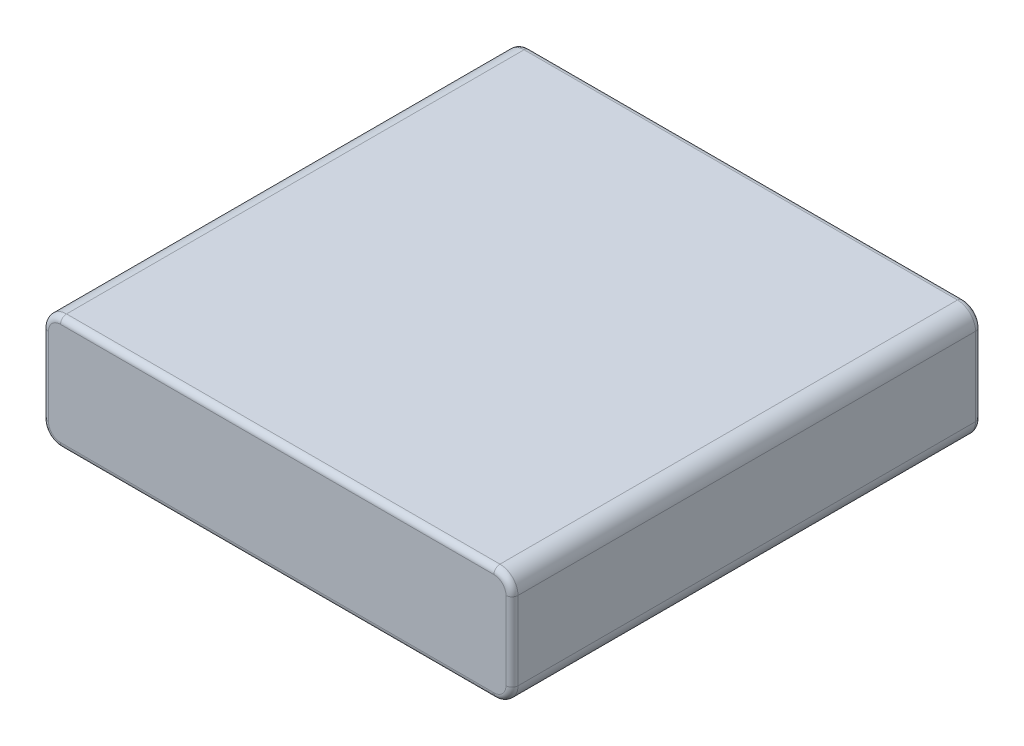
ISO-10303-21;
HEADER;
FILE_DESCRIPTION(('STEP AP214'),'2;1');
FILE_NAME('part.step','',(''),(''),'','','');
FILE_SCHEMA(('AUTOMOTIVE_DESIGN { 1 0 10303 214 1 1 1 1 }'));
ENDSEC;
DATA;
#1=APPLICATION_CONTEXT('core data for automotive mechanical design processes');
#2=APPLICATION_PROTOCOL_DEFINITION('international standard','automotive_design',2000,#1);
#3=PRODUCT_CONTEXT('',#1,'mechanical');
#4=PRODUCT('Part','Part','',(#3));
#5=PRODUCT_RELATED_PRODUCT_CATEGORY('part','',(#4));
#6=PRODUCT_DEFINITION_FORMATION('','',#4);
#7=PRODUCT_DEFINITION_CONTEXT('part definition',#1,'design');
#8=PRODUCT_DEFINITION('design','',#6,#7);
#9=PRODUCT_DEFINITION_SHAPE('','',#8);
#10=(LENGTH_UNIT() NAMED_UNIT(*) SI_UNIT(.MILLI.,.METRE.));
#11=(NAMED_UNIT(*) PLANE_ANGLE_UNIT() SI_UNIT($,.RADIAN.));
#12=(NAMED_UNIT(*) SI_UNIT($,.STERADIAN.) SOLID_ANGLE_UNIT());
#13=UNCERTAINTY_MEASURE_WITH_UNIT(LENGTH_MEASURE(1.E-05),#10,'distance_accuracy_value','');
#14=(GEOMETRIC_REPRESENTATION_CONTEXT(3) GLOBAL_UNCERTAINTY_ASSIGNED_CONTEXT((#13)) GLOBAL_UNIT_ASSIGNED_CONTEXT((#10,
#11,#12)) REPRESENTATION_CONTEXT('',''));
#15=CARTESIAN_POINT('',(0.,0.,0.));
#16=DIRECTION('',(0.,0.,1.));
#17=DIRECTION('',(1.,0.,0.));
#18=AXIS2_PLACEMENT_3D('',#15,#16,#17);
#19=CARTESIAN_POINT('',(-39.,9.5,-39.));
#20=DIRECTION('',(0.,0.,1.));
#21=DIRECTION('',(1.,0.,0.));
#22=AXIS2_PLACEMENT_3D('',#19,#20,#21);
#23=PLANE('',#22);
#24=CARTESIAN_POINT('',(33.,-2.5,-39.));
#25=DIRECTION('',(0.,0.,-1.));
#26=DIRECTION('',(-1.,0.,0.));
#27=AXIS2_PLACEMENT_3D('',#24,#25,#26);
#28=CIRCLE('',#27,1.75);
#29=CARTESIAN_POINT('',(31.25,-2.5,-39.));
#30=VERTEX_POINT('',#29);
#31=EDGE_CURVE('E222',#30,#30,#28,.T.);
#32=ORIENTED_EDGE('',*,*,#31,.F.);
#33=EDGE_LOOP('',(#32));
#34=FACE_BOUND('',#33,.T.);
#35=CARTESIAN_POINT('',(36.,-6.5,-39.));
#36=DIRECTION('',(0.,0.,1.));
#37=DIRECTION('',(1.,0.,0.));
#38=AXIS2_PLACEMENT_3D('',#35,#36,#37);
#39=CIRCLE('',#38,2.);
#40=CARTESIAN_POINT('',(36.,-8.5,-39.));
#41=VERTEX_POINT('',#40);
#42=CARTESIAN_POINT('',(38.,-6.5,-39.));
#43=VERTEX_POINT('',#42);
#44=EDGE_CURVE('E270',#41,#43,#39,.T.);
#45=ORIENTED_EDGE('',*,*,#44,.F.);
#46=DIRECTION('',(-1.,0.,0.));
#47=VECTOR('',#46,1.);
#48=CARTESIAN_POINT('',(-39.,-8.5,-39.));
#49=LINE('',#48,#47);
#50=CARTESIAN_POINT('',(-36.,-8.5,-39.));
#51=VERTEX_POINT('',#50);
#52=EDGE_CURVE('E235',#41,#51,#49,.T.);
#53=ORIENTED_EDGE('',*,*,#52,.T.);
#54=CARTESIAN_POINT('',(-36.,-6.5,-39.));
#55=DIRECTION('',(0.,0.,1.));
#56=DIRECTION('',(1.,0.,0.));
#57=AXIS2_PLACEMENT_3D('',#54,#55,#56);
#58=CIRCLE('',#57,2.);
#59=CARTESIAN_POINT('',(-38.,-6.5,-39.));
#60=VERTEX_POINT('',#59);
#61=EDGE_CURVE('E265',#60,#51,#58,.T.);
#62=ORIENTED_EDGE('',*,*,#61,.F.);
#63=DIRECTION('',(0.,-1.,0.));
#64=VECTOR('',#63,1.);
#65=CARTESIAN_POINT('',(-38.,9.5,-39.));
#66=LINE('',#65,#64);
#67=CARTESIAN_POINT('',(-38.,6.5,-39.));
#68=VERTEX_POINT('',#67);
#69=EDGE_CURVE('E242',#60,#68,#66,.F.);
#70=ORIENTED_EDGE('',*,*,#69,.T.);
#71=CARTESIAN_POINT('',(-36.,6.5,-39.));
#72=DIRECTION('',(0.,0.,1.));
#73=DIRECTION('',(1.,0.,0.));
#74=AXIS2_PLACEMENT_3D('',#71,#72,#73);
#75=CIRCLE('',#74,2.);
#76=CARTESIAN_POINT('',(-36.,8.5,-39.));
#77=VERTEX_POINT('',#76);
#78=EDGE_CURVE('E259',#77,#68,#75,.T.);
#79=ORIENTED_EDGE('',*,*,#78,.F.);
#80=DIRECTION('',(-1.,0.,0.));
#81=VECTOR('',#80,1.);
#82=CARTESIAN_POINT('',(39.,8.5,-39.));
#83=LINE('',#82,#81);
#84=CARTESIAN_POINT('',(36.,8.5,-39.));
#85=VERTEX_POINT('',#84);
#86=EDGE_CURVE('E239',#77,#85,#83,.F.);
#87=ORIENTED_EDGE('',*,*,#86,.T.);
#88=CARTESIAN_POINT('',(36.,6.5,-39.));
#89=DIRECTION('',(0.,0.,1.));
#90=DIRECTION('',(1.,0.,0.));
#91=AXIS2_PLACEMENT_3D('',#88,#89,#90);
#92=CIRCLE('',#91,2.);
#93=CARTESIAN_POINT('',(38.,6.5,-39.));
#94=VERTEX_POINT('',#93);
#95=EDGE_CURVE('E262',#94,#85,#92,.T.);
#96=ORIENTED_EDGE('',*,*,#95,.F.);
#97=DIRECTION('',(0.,-1.,0.));
#98=VECTOR('',#97,1.);
#99=CARTESIAN_POINT('',(38.,9.5,-39.));
#100=LINE('',#99,#98);
#101=EDGE_CURVE('E237',#94,#43,#100,.T.);
#102=ORIENTED_EDGE('',*,*,#101,.T.);
#103=EDGE_LOOP('',(#45,#53,#62,#70,#79,#87,#96,#102));
#104=FACE_BOUND('',#103,.T.);
#105=ADVANCED_FACE('F43',(#34,#104),#23,.F.);
#106=CARTESIAN_POINT('',(39.,9.5,-39.));
#107=DIRECTION('',(-1.,0.,0.));
#108=DIRECTION('',(0.,0.,1.));
#109=AXIS2_PLACEMENT_3D('',#106,#107,#108);
#110=PLANE('',#109);
#111=DIRECTION('',(0.,0.,-1.));
#112=VECTOR('',#111,1.);
#113=CARTESIAN_POINT('',(39.,6.5,39.));
#114=LINE('',#113,#112);
#115=CARTESIAN_POINT('',(39.,6.5,-38.));
#116=VERTEX_POINT('',#115);
#117=CARTESIAN_POINT('',(39.,6.5,38.));
#118=VERTEX_POINT('',#117);
#119=EDGE_CURVE('E299',#116,#118,#114,.F.);
#120=ORIENTED_EDGE('',*,*,#119,.T.);
#121=DIRECTION('',(0.,-1.,0.));
#122=VECTOR('',#121,1.);
#123=CARTESIAN_POINT('',(39.,9.5,38.));
#124=LINE('',#123,#122);
#125=CARTESIAN_POINT('',(39.,-6.5,38.));
#126=VERTEX_POINT('',#125);
#127=EDGE_CURVE('E11',#118,#126,#124,.T.);
#128=ORIENTED_EDGE('',*,*,#127,.T.);
#129=DIRECTION('',(0.,0.,-1.));
#130=VECTOR('',#129,1.);
#131=CARTESIAN_POINT('',(39.,-6.5,-39.));
#132=LINE('',#131,#130);
#133=CARTESIAN_POINT('',(39.,-6.5,-38.));
#134=VERTEX_POINT('',#133);
#135=EDGE_CURVE('E296',#126,#134,#132,.T.);
#136=ORIENTED_EDGE('',*,*,#135,.T.);
#137=DIRECTION('',(0.,-1.,0.));
#138=VECTOR('',#137,1.);
#139=CARTESIAN_POINT('',(39.,9.5,-38.));
#140=LINE('',#139,#138);
#141=EDGE_CURVE('E246',#134,#116,#140,.F.);
#142=ORIENTED_EDGE('',*,*,#141,.T.);
#143=EDGE_LOOP('',(#120,#128,#136,#142));
#144=FACE_BOUND('',#143,.T.);
#145=ADVANCED_FACE('F433',(#144),#110,.F.);
#146=CARTESIAN_POINT('',(-39.,9.5,-39.));
#147=DIRECTION('',(1.,0.,0.));
#148=DIRECTION('',(0.,0.,-1.));
#149=AXIS2_PLACEMENT_3D('',#146,#147,#148);
#150=PLANE('',#149);
#151=DIRECTION('',(0.,0.,1.));
#152=VECTOR('',#151,1.);
#153=CARTESIAN_POINT('',(-39.,-6.5,-39.));
#154=LINE('',#153,#152);
#155=CARTESIAN_POINT('',(-39.,-6.5,-38.));
#156=VERTEX_POINT('',#155);
#157=CARTESIAN_POINT('',(-39.,-6.5,38.));
#158=VERTEX_POINT('',#157);
#159=EDGE_CURVE('E289',#156,#158,#154,.T.);
#160=ORIENTED_EDGE('',*,*,#159,.T.);
#161=DIRECTION('',(0.,-1.,0.));
#162=VECTOR('',#161,1.);
#163=CARTESIAN_POINT('',(-39.,9.5,38.));
#164=LINE('',#163,#162);
#165=CARTESIAN_POINT('',(-39.,6.5,38.));
#166=VERTEX_POINT('',#165);
#167=EDGE_CURVE('E333',#158,#166,#164,.F.);
#168=ORIENTED_EDGE('',*,*,#167,.T.);
#169=DIRECTION('',(0.,0.,1.));
#170=VECTOR('',#169,1.);
#171=CARTESIAN_POINT('',(-39.,6.5,-38.));
#172=LINE('',#171,#170);
#173=CARTESIAN_POINT('',(-39.,6.5,-38.));
#174=VERTEX_POINT('',#173);
#175=EDGE_CURVE('E288',#166,#174,#172,.F.);
#176=ORIENTED_EDGE('',*,*,#175,.T.);
#177=DIRECTION('',(0.,-1.,0.));
#178=VECTOR('',#177,1.);
#179=CARTESIAN_POINT('',(-39.,9.5,-38.));
#180=LINE('',#179,#178);
#181=EDGE_CURVE('E229',#174,#156,#180,.T.);
#182=ORIENTED_EDGE('',*,*,#181,.T.);
#183=EDGE_LOOP('',(#160,#168,#176,#182));
#184=FACE_BOUND('',#183,.T.);
#185=ADVANCED_FACE('F377',(#184),#150,.F.);
#186=CARTESIAN_POINT('',(-39.,9.5,39.));
#187=DIRECTION('',(0.,0.,-1.));
#188=DIRECTION('',(-1.,0.,0.));
#189=AXIS2_PLACEMENT_3D('',#186,#187,#188);
#190=PLANE('',#189);
#191=DIRECTION('',(0.,-1.,0.));
#192=VECTOR('',#191,1.);
#193=CARTESIAN_POINT('',(38.,9.5,39.));
#194=LINE('',#193,#192);
#195=CARTESIAN_POINT('',(38.,-6.5,39.));
#196=VERTEX_POINT('',#195);
#197=CARTESIAN_POINT('',(38.,6.5,39.));
#198=VERTEX_POINT('',#197);
#199=EDGE_CURVE('E300',#196,#198,#194,.F.);
#200=ORIENTED_EDGE('',*,*,#199,.T.);
#201=CARTESIAN_POINT('',(36.,6.5,39.));
#202=DIRECTION('',(0.,0.,-1.));
#203=DIRECTION('',(-1.,0.,0.));
#204=AXIS2_PLACEMENT_3D('',#201,#202,#203);
#205=CIRCLE('',#204,2.);
#206=CARTESIAN_POINT('',(36.,8.5,39.));
#207=VERTEX_POINT('',#206);
#208=EDGE_CURVE('E324',#198,#207,#205,.F.);
#209=ORIENTED_EDGE('',*,*,#208,.T.);
#210=DIRECTION('',(1.,0.,0.));
#211=VECTOR('',#210,1.);
#212=CARTESIAN_POINT('',(-36.,8.5,39.));
#213=LINE('',#212,#211);
#214=CARTESIAN_POINT('',(-36.,8.5,39.));
#215=VERTEX_POINT('',#214);
#216=EDGE_CURVE('E323',#207,#215,#213,.F.);
#217=ORIENTED_EDGE('',*,*,#216,.T.);
#218=CARTESIAN_POINT('',(-36.,6.5,39.));
#219=DIRECTION('',(0.,0.,-1.));
#220=DIRECTION('',(-1.,0.,0.));
#221=AXIS2_PLACEMENT_3D('',#218,#219,#220);
#222=CIRCLE('',#221,2.);
#223=CARTESIAN_POINT('',(-38.,6.5,39.));
#224=VERTEX_POINT('',#223);
#225=EDGE_CURVE('E321',#215,#224,#222,.F.);
#226=ORIENTED_EDGE('',*,*,#225,.T.);
#227=DIRECTION('',(0.,-1.,0.));
#228=VECTOR('',#227,1.);
#229=CARTESIAN_POINT('',(-38.,9.5,39.));
#230=LINE('',#229,#228);
#231=CARTESIAN_POINT('',(-38.,-6.5,39.));
#232=VERTEX_POINT('',#231);
#233=EDGE_CURVE('E317',#224,#232,#230,.T.);
#234=ORIENTED_EDGE('',*,*,#233,.T.);
#235=CARTESIAN_POINT('',(-36.,-6.5,39.));
#236=DIRECTION('',(0.,0.,-1.));
#237=DIRECTION('',(-1.,0.,0.));
#238=AXIS2_PLACEMENT_3D('',#235,#236,#237);
#239=CIRCLE('',#238,2.);
#240=CARTESIAN_POINT('',(-36.,-8.5,39.));
#241=VERTEX_POINT('',#240);
#242=EDGE_CURVE('E320',#232,#241,#239,.F.);
#243=ORIENTED_EDGE('',*,*,#242,.T.);
#244=DIRECTION('',(1.,0.,0.));
#245=VECTOR('',#244,1.);
#246=CARTESIAN_POINT('',(-39.,-8.5,39.));
#247=LINE('',#246,#245);
#248=CARTESIAN_POINT('',(36.,-8.5,39.));
#249=VERTEX_POINT('',#248);
#250=EDGE_CURVE('E312',#241,#249,#247,.T.);
#251=ORIENTED_EDGE('',*,*,#250,.T.);
#252=CARTESIAN_POINT('',(36.,-6.5,39.));
#253=DIRECTION('',(0.,0.,-1.));
#254=DIRECTION('',(-1.,0.,0.));
#255=AXIS2_PLACEMENT_3D('',#252,#253,#254);
#256=CIRCLE('',#255,2.);
#257=EDGE_CURVE('E311',#249,#196,#256,.F.);
#258=ORIENTED_EDGE('',*,*,#257,.T.);
#259=EDGE_LOOP('',(#200,#209,#217,#226,#234,#243,#251,#258));
#260=FACE_BOUND('',#259,.T.);
#261=ADVANCED_FACE('F479',(#260),#190,.F.);
#262=CARTESIAN_POINT('',(0.,9.5,0.));
#263=DIRECTION('',(0.,1.,0.));
#264=DIRECTION('',(0.,0.,1.));
#265=AXIS2_PLACEMENT_3D('',#262,#263,#264);
#266=PLANE('',#265);
#267=DIRECTION('',(0.,0.,1.));
#268=VECTOR('',#267,1.);
#269=CARTESIAN_POINT('',(-36.,9.5,39.));
#270=LINE('',#269,#268);
#271=CARTESIAN_POINT('',(-36.,9.5,-38.));
#272=VERTEX_POINT('',#271);
#273=CARTESIAN_POINT('',(-36.,9.5,38.));
#274=VERTEX_POINT('',#273);
#275=EDGE_CURVE('E283',#272,#274,#270,.T.);
#276=ORIENTED_EDGE('',*,*,#275,.T.);
#277=DIRECTION('',(1.,0.,0.));
#278=VECTOR('',#277,1.);
#279=CARTESIAN_POINT('',(36.,9.5,38.));
#280=LINE('',#279,#278);
#281=CARTESIAN_POINT('',(36.,9.5,38.));
#282=VERTEX_POINT('',#281);
#283=EDGE_CURVE('E332',#274,#282,#280,.T.);
#284=ORIENTED_EDGE('',*,*,#283,.T.);
#285=DIRECTION('',(0.,0.,-1.));
#286=VECTOR('',#285,1.);
#287=CARTESIAN_POINT('',(36.,9.5,-38.));
#288=LINE('',#287,#286);
#289=CARTESIAN_POINT('',(36.,9.5,-38.));
#290=VERTEX_POINT('',#289);
#291=EDGE_CURVE('E282',#282,#290,#288,.T.);
#292=ORIENTED_EDGE('',*,*,#291,.T.);
#293=DIRECTION('',(-1.,0.,0.));
#294=VECTOR('',#293,1.);
#295=CARTESIAN_POINT('',(-39.,9.5,-38.));
#296=LINE('',#295,#294);
#297=EDGE_CURVE('E245',#290,#272,#296,.T.);
#298=ORIENTED_EDGE('',*,*,#297,.T.);
#299=EDGE_LOOP('',(#276,#284,#292,#298));
#300=FACE_BOUND('',#299,.T.);
#301=ADVANCED_FACE('F691',(#300),#266,.T.);
#302=CARTESIAN_POINT('',(0.,-9.5,0.));
#303=DIRECTION('',(0.,1.,0.));
#304=DIRECTION('',(0.,0.,1.));
#305=AXIS2_PLACEMENT_3D('',#302,#303,#304);
#306=PLANE('',#305);
#307=DIRECTION('',(-1.,0.,0.));
#308=VECTOR('',#307,1.);
#309=CARTESIAN_POINT('',(-24.1,-9.5,-31.));
#310=LINE('',#309,#308);
#311=CARTESIAN_POINT('',(-24.1,-9.5,-31.));
#312=VERTEX_POINT('',#311);
#313=CARTESIAN_POINT('',(-30.1,-9.5,-31.));
#314=VERTEX_POINT('',#313);
#315=EDGE_CURVE('E212',#312,#314,#310,.T.);
#316=ORIENTED_EDGE('',*,*,#315,.F.);
#317=DIRECTION('',(0.,0.,1.));
#318=VECTOR('',#317,1.);
#319=CARTESIAN_POINT('',(-24.1,-9.5,-35.));
#320=LINE('',#319,#318);
#321=CARTESIAN_POINT('',(-24.1,-9.5,-35.));
#322=VERTEX_POINT('',#321);
#323=EDGE_CURVE('E189',#322,#312,#320,.T.);
#324=ORIENTED_EDGE('',*,*,#323,.F.);
#325=DIRECTION('',(1.,0.,0.));
#326=VECTOR('',#325,1.);
#327=CARTESIAN_POINT('',(-24.1,-9.5,-35.));
#328=LINE('',#327,#326);
#329=CARTESIAN_POINT('',(-30.1,-9.5,-35.));
#330=VERTEX_POINT('',#329);
#331=EDGE_CURVE('E202',#330,#322,#328,.T.);
#332=ORIENTED_EDGE('',*,*,#331,.F.);
#333=DIRECTION('',(0.,0.,-1.));
#334=VECTOR('',#333,1.);
#335=CARTESIAN_POINT('',(-30.1,-9.5,-35.));
#336=LINE('',#335,#334);
#337=EDGE_CURVE('E208',#314,#330,#336,.T.);
#338=ORIENTED_EDGE('',*,*,#337,.F.);
#339=EDGE_LOOP('',(#316,#324,#332,#338));
#340=FACE_BOUND('',#339,.T.);
#341=DIRECTION('',(0.,0.,-1.));
#342=VECTOR('',#341,1.);
#343=CARTESIAN_POINT('',(36.,-9.5,0.));
#344=LINE('',#343,#342);
#345=CARTESIAN_POINT('',(36.,-9.5,-38.));
#346=VERTEX_POINT('',#345);
#347=CARTESIAN_POINT('',(36.,-9.5,38.));
#348=VERTEX_POINT('',#347);
#349=EDGE_CURVE('E295',#346,#348,#344,.F.);
#350=ORIENTED_EDGE('',*,*,#349,.T.);
#351=DIRECTION('',(1.,0.,0.));
#352=VECTOR('',#351,1.);
#353=CARTESIAN_POINT('',(0.,-9.5,38.));
#354=LINE('',#353,#352);
#355=CARTESIAN_POINT('',(-36.,-9.5,38.));
#356=VERTEX_POINT('',#355);
#357=EDGE_CURVE('E338',#348,#356,#354,.F.);
#358=ORIENTED_EDGE('',*,*,#357,.T.);
#359=DIRECTION('',(0.,0.,1.));
#360=VECTOR('',#359,1.);
#361=CARTESIAN_POINT('',(-36.,-9.5,0.));
#362=LINE('',#361,#360);
#363=CARTESIAN_POINT('',(-36.,-9.5,-38.));
#364=VERTEX_POINT('',#363);
#365=EDGE_CURVE('E294',#356,#364,#362,.F.);
#366=ORIENTED_EDGE('',*,*,#365,.T.);
#367=DIRECTION('',(-1.,0.,0.));
#368=VECTOR('',#367,1.);
#369=CARTESIAN_POINT('',(0.,-9.5,-38.));
#370=LINE('',#369,#368);
#371=EDGE_CURVE('E253',#364,#346,#370,.F.);
#372=ORIENTED_EDGE('',*,*,#371,.T.);
#373=EDGE_LOOP('',(#350,#358,#366,#372));
#374=FACE_BOUND('',#373,.T.);
#375=ADVANCED_FACE('F683',(#340,#374),#306,.F.);
#376=CARTESIAN_POINT('',(33.,-2.5,-20.));
#377=DIRECTION('',(0.,0.,-1.));
#378=DIRECTION('',(-1.,0.,0.));
#379=AXIS2_PLACEMENT_3D('',#376,#377,#378);
#380=CYLINDRICAL_SURFACE('',#379,1.75);
#381=CARTESIAN_POINT('',(33.,-2.5,-20.));
#382=DIRECTION('',(0.,0.,-1.));
#383=DIRECTION('',(-1.,0.,0.));
#384=AXIS2_PLACEMENT_3D('',#381,#382,#383);
#385=CIRCLE('',#384,1.75);
#386=CARTESIAN_POINT('',(31.25,-2.5,-20.));
#387=VERTEX_POINT('',#386);
#388=EDGE_CURVE('E223',#387,#387,#385,.T.);
#389=ORIENTED_EDGE('',*,*,#388,.F.);
#390=EDGE_LOOP('',(#389));
#391=FACE_BOUND('',#390,.T.);
#392=ORIENTED_EDGE('',*,*,#31,.T.);
#393=EDGE_LOOP('',(#392));
#394=FACE_BOUND('',#393,.T.);
#395=ADVANCED_FACE('F673',(#391,#394),#380,.F.);
#396=CARTESIAN_POINT('',(33.,-2.5,-20.));
#397=DIRECTION('',(0.,0.,-1.));
#398=DIRECTION('',(-1.,0.,0.));
#399=AXIS2_PLACEMENT_3D('',#396,#397,#398);
#400=PLANE('',#399);
#401=ORIENTED_EDGE('',*,*,#388,.T.);
#402=EDGE_LOOP('',(#401));
#403=FACE_BOUND('',#402,.T.);
#404=ADVANCED_FACE('F667',(#403),#400,.T.);
#405=CARTESIAN_POINT('',(-24.1,-4.5,-35.));
#406=DIRECTION('',(1.,0.,0.));
#407=DIRECTION('',(0.,0.,-1.));
#408=AXIS2_PLACEMENT_3D('',#405,#406,#407);
#409=PLANE('',#408);
#410=ORIENTED_EDGE('',*,*,#323,.T.);
#411=DIRECTION('',(0.,-1.,0.));
#412=VECTOR('',#411,1.);
#413=CARTESIAN_POINT('',(-24.1,-4.5,-31.));
#414=LINE('',#413,#412);
#415=CARTESIAN_POINT('',(-24.1,-4.5,-31.));
#416=VERTEX_POINT('',#415);
#417=EDGE_CURVE('E182',#416,#312,#414,.T.);
#418=ORIENTED_EDGE('',*,*,#417,.F.);
#419=DIRECTION('',(0.,0.,1.));
#420=VECTOR('',#419,1.);
#421=CARTESIAN_POINT('',(-24.1,-4.5,-35.));
#422=LINE('',#421,#420);
#423=CARTESIAN_POINT('',(-24.1,-4.5,-35.));
#424=VERTEX_POINT('',#423);
#425=EDGE_CURVE('E183',#424,#416,#422,.T.);
#426=ORIENTED_EDGE('',*,*,#425,.F.);
#427=DIRECTION('',(0.,-1.,0.));
#428=VECTOR('',#427,1.);
#429=CARTESIAN_POINT('',(-24.1,-4.5,-35.));
#430=LINE('',#429,#428);
#431=EDGE_CURVE('E218',#424,#322,#430,.T.);
#432=ORIENTED_EDGE('',*,*,#431,.T.);
#433=EDGE_LOOP('',(#410,#418,#426,#432));
#434=FACE_BOUND('',#433,.T.);
#435=ADVANCED_FACE('F181',(#434),#409,.F.);
#436=CARTESIAN_POINT('',(-24.1,-4.5,-35.));
#437=DIRECTION('',(0.,0.,-1.));
#438=DIRECTION('',(-1.,0.,0.));
#439=AXIS2_PLACEMENT_3D('',#436,#437,#438);
#440=PLANE('',#439);
#441=ORIENTED_EDGE('',*,*,#331,.T.);
#442=ORIENTED_EDGE('',*,*,#431,.F.);
#443=DIRECTION('',(1.,0.,0.));
#444=VECTOR('',#443,1.);
#445=CARTESIAN_POINT('',(-24.1,-4.5,-35.));
#446=LINE('',#445,#444);
#447=CARTESIAN_POINT('',(-30.1,-4.5,-35.));
#448=VERTEX_POINT('',#447);
#449=EDGE_CURVE('E191',#448,#424,#446,.T.);
#450=ORIENTED_EDGE('',*,*,#449,.F.);
#451=DIRECTION('',(0.,-1.,0.));
#452=VECTOR('',#451,1.);
#453=CARTESIAN_POINT('',(-30.1,-4.5,-35.));
#454=LINE('',#453,#452);
#455=EDGE_CURVE('E225',#448,#330,#454,.T.);
#456=ORIENTED_EDGE('',*,*,#455,.T.);
#457=EDGE_LOOP('',(#441,#442,#450,#456));
#458=FACE_BOUND('',#457,.T.);
#459=ADVANCED_FACE('F649',(#458),#440,.F.);
#460=CARTESIAN_POINT('',(-30.1,-4.5,-35.));
#461=DIRECTION('',(-1.,0.,0.));
#462=DIRECTION('',(0.,0.,1.));
#463=AXIS2_PLACEMENT_3D('',#460,#461,#462);
#464=PLANE('',#463);
#465=ORIENTED_EDGE('',*,*,#337,.T.);
#466=ORIENTED_EDGE('',*,*,#455,.F.);
#467=DIRECTION('',(0.,0.,-1.));
#468=VECTOR('',#467,1.);
#469=CARTESIAN_POINT('',(-30.1,-4.5,-35.));
#470=LINE('',#469,#468);
#471=CARTESIAN_POINT('',(-30.1,-4.5,-31.));
#472=VERTEX_POINT('',#471);
#473=EDGE_CURVE('E203',#472,#448,#470,.T.);
#474=ORIENTED_EDGE('',*,*,#473,.F.);
#475=DIRECTION('',(0.,-1.,0.));
#476=VECTOR('',#475,1.);
#477=CARTESIAN_POINT('',(-30.1,-4.5,-31.));
#478=LINE('',#477,#476);
#479=EDGE_CURVE('E195',#472,#314,#478,.T.);
#480=ORIENTED_EDGE('',*,*,#479,.T.);
#481=EDGE_LOOP('',(#465,#466,#474,#480));
#482=FACE_BOUND('',#481,.T.);
#483=ADVANCED_FACE('F645',(#482),#464,.F.);
#484=CARTESIAN_POINT('',(-24.1,-4.5,-31.));
#485=DIRECTION('',(0.,0.,1.));
#486=DIRECTION('',(1.,0.,0.));
#487=AXIS2_PLACEMENT_3D('',#484,#485,#486);
#488=PLANE('',#487);
#489=ORIENTED_EDGE('',*,*,#315,.T.);
#490=ORIENTED_EDGE('',*,*,#479,.F.);
#491=DIRECTION('',(-1.,0.,0.));
#492=VECTOR('',#491,1.);
#493=CARTESIAN_POINT('',(-24.1,-4.5,-31.));
#494=LINE('',#493,#492);
#495=EDGE_CURVE('E198',#416,#472,#494,.T.);
#496=ORIENTED_EDGE('',*,*,#495,.F.);
#497=ORIENTED_EDGE('',*,*,#417,.T.);
#498=EDGE_LOOP('',(#489,#490,#496,#497));
#499=FACE_BOUND('',#498,.T.);
#500=ADVANCED_FACE('F197',(#499),#488,.F.);
#501=CARTESIAN_POINT('',(0.,-4.5,0.));
#502=DIRECTION('',(0.,-1.,0.));
#503=DIRECTION('',(0.,0.,-1.));
#504=AXIS2_PLACEMENT_3D('',#501,#502,#503);
#505=PLANE('',#504);
#506=ORIENTED_EDGE('',*,*,#425,.T.);
#507=ORIENTED_EDGE('',*,*,#495,.T.);
#508=ORIENTED_EDGE('',*,*,#473,.T.);
#509=ORIENTED_EDGE('',*,*,#449,.T.);
#510=EDGE_LOOP('',(#506,#507,#508,#509));
#511=FACE_BOUND('',#510,.T.);
#512=ADVANCED_FACE('F201',(#511),#505,.T.);
#513=CARTESIAN_POINT('',(38.,9.5,-38.));
#514=DIRECTION('',(0.,-1.,0.));
#515=DIRECTION('',(0.,0.,-1.));
#516=AXIS2_PLACEMENT_3D('',#513,#514,#515);
#517=CYLINDRICAL_SURFACE('',#516,1.);
#518=ORIENTED_EDGE('',*,*,#141,.F.);
#519=CARTESIAN_POINT('',(38.,-6.5,-38.));
#520=DIRECTION('',(0.,1.,0.));
#521=DIRECTION('',(0.,0.,1.));
#522=AXIS2_PLACEMENT_3D('',#519,#520,#521);
#523=CIRCLE('',#522,1.);
#524=EDGE_CURVE('E258',#134,#43,#523,.T.);
#525=ORIENTED_EDGE('',*,*,#524,.T.);
#526=ORIENTED_EDGE('',*,*,#101,.F.);
#527=CARTESIAN_POINT('',(38.,6.5,-38.));
#528=DIRECTION('',(0.,-1.,0.));
#529=DIRECTION('',(0.,0.,-1.));
#530=AXIS2_PLACEMENT_3D('',#527,#528,#529);
#531=CIRCLE('',#530,1.);
#532=EDGE_CURVE('E255',#94,#116,#531,.T.);
#533=ORIENTED_EDGE('',*,*,#532,.T.);
#534=EDGE_LOOP('',(#518,#525,#526,#533));
#535=FACE_BOUND('',#534,.T.);
#536=ADVANCED_FACE('F409',(#535),#517,.T.);
#537=CARTESIAN_POINT('',(0.,8.5,-38.));
#538=DIRECTION('',(1.,0.,0.));
#539=DIRECTION('',(0.,0.,-1.));
#540=AXIS2_PLACEMENT_3D('',#537,#538,#539);
#541=CYLINDRICAL_SURFACE('',#540,1.);
#542=ORIENTED_EDGE('',*,*,#297,.F.);
#543=CARTESIAN_POINT('',(36.,8.5,-38.));
#544=DIRECTION('',(-1.,0.,0.));
#545=DIRECTION('',(0.,0.,1.));
#546=AXIS2_PLACEMENT_3D('',#543,#544,#545);
#547=CIRCLE('',#546,1.);
#548=EDGE_CURVE('E271',#290,#85,#547,.T.);
#549=ORIENTED_EDGE('',*,*,#548,.T.);
#550=ORIENTED_EDGE('',*,*,#86,.F.);
#551=CARTESIAN_POINT('',(-36.,8.5,-38.));
#552=DIRECTION('',(1.,0.,0.));
#553=DIRECTION('',(0.,0.,-1.));
#554=AXIS2_PLACEMENT_3D('',#551,#552,#553);
#555=CIRCLE('',#554,1.);
#556=EDGE_CURVE('E267',#77,#272,#555,.T.);
#557=ORIENTED_EDGE('',*,*,#556,.T.);
#558=EDGE_LOOP('',(#542,#549,#550,#557));
#559=FACE_BOUND('',#558,.T.);
#560=ADVANCED_FACE('F398',(#559),#541,.T.);
#561=CARTESIAN_POINT('',(-39.,-8.5,-38.));
#562=DIRECTION('',(-1.,0.,0.));
#563=DIRECTION('',(0.,0.,1.));
#564=AXIS2_PLACEMENT_3D('',#561,#562,#563);
#565=CYLINDRICAL_SURFACE('',#564,1.);
#566=ORIENTED_EDGE('',*,*,#371,.F.);
#567=CARTESIAN_POINT('',(-36.,-8.5,-38.));
#568=DIRECTION('',(1.,0.,0.));
#569=DIRECTION('',(0.,0.,-1.));
#570=AXIS2_PLACEMENT_3D('',#567,#568,#569);
#571=CIRCLE('',#570,1.);
#572=EDGE_CURVE('E274',#364,#51,#571,.T.);
#573=ORIENTED_EDGE('',*,*,#572,.T.);
#574=ORIENTED_EDGE('',*,*,#52,.F.);
#575=CARTESIAN_POINT('',(36.,-8.5,-38.));
#576=DIRECTION('',(-1.,0.,0.));
#577=DIRECTION('',(0.,0.,1.));
#578=AXIS2_PLACEMENT_3D('',#575,#576,#577);
#579=CIRCLE('',#578,1.);
#580=EDGE_CURVE('E272',#41,#346,#579,.T.);
#581=ORIENTED_EDGE('',*,*,#580,.T.);
#582=EDGE_LOOP('',(#566,#573,#574,#581));
#583=FACE_BOUND('',#582,.T.);
#584=ADVANCED_FACE('F417',(#583),#565,.T.);
#585=CARTESIAN_POINT('',(-38.,9.5,-38.));
#586=DIRECTION('',(0.,-1.,0.));
#587=DIRECTION('',(0.,0.,-1.));
#588=AXIS2_PLACEMENT_3D('',#585,#586,#587);
#589=CYLINDRICAL_SURFACE('',#588,1.);
#590=ORIENTED_EDGE('',*,*,#181,.F.);
#591=CARTESIAN_POINT('',(-38.,6.5,-38.));
#592=DIRECTION('',(0.,-1.,0.));
#593=DIRECTION('',(0.,0.,-1.));
#594=AXIS2_PLACEMENT_3D('',#591,#592,#593);
#595=CIRCLE('',#594,1.);
#596=EDGE_CURVE('E278',#174,#68,#595,.T.);
#597=ORIENTED_EDGE('',*,*,#596,.T.);
#598=ORIENTED_EDGE('',*,*,#69,.F.);
#599=CARTESIAN_POINT('',(-38.,-6.5,-38.));
#600=DIRECTION('',(0.,1.,0.));
#601=DIRECTION('',(0.,0.,1.));
#602=AXIS2_PLACEMENT_3D('',#599,#600,#601);
#603=CIRCLE('',#602,1.);
#604=EDGE_CURVE('E279',#60,#156,#603,.T.);
#605=ORIENTED_EDGE('',*,*,#604,.T.);
#606=EDGE_LOOP('',(#590,#597,#598,#605));
#607=FACE_BOUND('',#606,.T.);
#608=ADVANCED_FACE('F383',(#607),#589,.T.);
#609=CARTESIAN_POINT('',(36.,-6.5,-39.));
#610=DIRECTION('',(0.,0.,-1.));
#611=DIRECTION('',(-1.,0.,0.));
#612=AXIS2_PLACEMENT_3D('',#609,#610,#611);
#613=CYLINDRICAL_SURFACE('',#612,3.);
#614=ORIENTED_EDGE('',*,*,#135,.F.);
#615=CARTESIAN_POINT('',(36.,-6.5,38.));
#616=DIRECTION('',(0.,0.,-1.));
#617=DIRECTION('',(-1.,0.,0.));
#618=AXIS2_PLACEMENT_3D('',#615,#616,#617);
#619=CIRCLE('',#618,3.);
#620=EDGE_CURVE('E55',#126,#348,#619,.T.);
#621=ORIENTED_EDGE('',*,*,#620,.T.);
#622=ORIENTED_EDGE('',*,*,#349,.F.);
#623=CARTESIAN_POINT('',(36.,-6.5,-38.));
#624=DIRECTION('',(0.,0.,1.));
#625=DIRECTION('',(1.,0.,0.));
#626=AXIS2_PLACEMENT_3D('',#623,#624,#625);
#627=CIRCLE('',#626,3.);
#628=EDGE_CURVE('E214',#134,#346,#627,.F.);
#629=ORIENTED_EDGE('',*,*,#628,.F.);
#630=EDGE_LOOP('',(#614,#621,#622,#629));
#631=FACE_BOUND('',#630,.T.);
#632=ADVANCED_FACE('F449',(#631),#613,.T.);
#633=CARTESIAN_POINT('',(36.,-6.5,-38.));
#634=DIRECTION('',(0.,0.,1.));
#635=DIRECTION('',(1.,0.,0.));
#636=AXIS2_PLACEMENT_3D('',#633,#634,#635);
#637=TOROIDAL_SURFACE('',#636,2.,1.);
#638=ORIENTED_EDGE('',*,*,#524,.F.);
#639=ORIENTED_EDGE('',*,*,#628,.T.);
#640=ORIENTED_EDGE('',*,*,#580,.F.);
#641=ORIENTED_EDGE('',*,*,#44,.T.);
#642=EDGE_LOOP('',(#638,#639,#640,#641));
#643=FACE_BOUND('',#642,.T.);
#644=ADVANCED_FACE('F415',(#643),#637,.T.);
#645=CARTESIAN_POINT('',(36.,6.5,0.));
#646=DIRECTION('',(0.,0.,1.));
#647=DIRECTION('',(1.,0.,0.));
#648=AXIS2_PLACEMENT_3D('',#645,#646,#647);
#649=CYLINDRICAL_SURFACE('',#648,3.);
#650=ORIENTED_EDGE('',*,*,#291,.F.);
#651=CARTESIAN_POINT('',(36.,6.5,38.));
#652=DIRECTION('',(0.,0.,-1.));
#653=DIRECTION('',(-1.,0.,0.));
#654=AXIS2_PLACEMENT_3D('',#651,#652,#653);
#655=CIRCLE('',#654,3.);
#656=EDGE_CURVE('E327',#282,#118,#655,.T.);
#657=ORIENTED_EDGE('',*,*,#656,.T.);
#658=ORIENTED_EDGE('',*,*,#119,.F.);
#659=CARTESIAN_POINT('',(36.,6.5,-38.));
#660=DIRECTION('',(0.,0.,1.));
#661=DIRECTION('',(1.,0.,0.));
#662=AXIS2_PLACEMENT_3D('',#659,#660,#661);
#663=CIRCLE('',#662,3.);
#664=EDGE_CURVE('E301',#290,#116,#663,.F.);
#665=ORIENTED_EDGE('',*,*,#664,.F.);
#666=EDGE_LOOP('',(#650,#657,#658,#665));
#667=FACE_BOUND('',#666,.T.);
#668=ADVANCED_FACE('F457',(#667),#649,.T.);
#669=CARTESIAN_POINT('',(36.,6.5,-38.));
#670=DIRECTION('',(0.,0.,1.));
#671=DIRECTION('',(1.,0.,0.));
#672=AXIS2_PLACEMENT_3D('',#669,#670,#671);
#673=TOROIDAL_SURFACE('',#672,2.,1.);
#674=ORIENTED_EDGE('',*,*,#532,.F.);
#675=ORIENTED_EDGE('',*,*,#95,.T.);
#676=ORIENTED_EDGE('',*,*,#548,.F.);
#677=ORIENTED_EDGE('',*,*,#664,.T.);
#678=EDGE_LOOP('',(#674,#675,#676,#677));
#679=FACE_BOUND('',#678,.T.);
#680=ADVANCED_FACE('F404',(#679),#673,.T.);
#681=CARTESIAN_POINT('',(-36.,-6.5,-39.));
#682=DIRECTION('',(0.,0.,1.));
#683=DIRECTION('',(1.,0.,0.));
#684=AXIS2_PLACEMENT_3D('',#681,#682,#683);
#685=CYLINDRICAL_SURFACE('',#684,3.);
#686=ORIENTED_EDGE('',*,*,#365,.F.);
#687=CARTESIAN_POINT('',(-36.,-6.5,38.));
#688=DIRECTION('',(0.,0.,-1.));
#689=DIRECTION('',(-1.,0.,0.));
#690=AXIS2_PLACEMENT_3D('',#687,#688,#689);
#691=CIRCLE('',#690,3.);
#692=EDGE_CURVE('E337',#356,#158,#691,.T.);
#693=ORIENTED_EDGE('',*,*,#692,.T.);
#694=ORIENTED_EDGE('',*,*,#159,.F.);
#695=CARTESIAN_POINT('',(-36.,-6.5,-38.));
#696=DIRECTION('',(0.,0.,1.));
#697=DIRECTION('',(1.,0.,0.));
#698=AXIS2_PLACEMENT_3D('',#695,#696,#697);
#699=CIRCLE('',#698,3.);
#700=EDGE_CURVE('E308',#364,#156,#699,.F.);
#701=ORIENTED_EDGE('',*,*,#700,.F.);
#702=EDGE_LOOP('',(#686,#693,#694,#701));
#703=FACE_BOUND('',#702,.T.);
#704=ADVANCED_FACE('F376',(#703),#685,.T.);
#705=CARTESIAN_POINT('',(-36.,-6.5,-38.));
#706=DIRECTION('',(0.,0.,1.));
#707=DIRECTION('',(1.,0.,0.));
#708=AXIS2_PLACEMENT_3D('',#705,#706,#707);
#709=TOROIDAL_SURFACE('',#708,2.,1.);
#710=ORIENTED_EDGE('',*,*,#572,.F.);
#711=ORIENTED_EDGE('',*,*,#700,.T.);
#712=ORIENTED_EDGE('',*,*,#604,.F.);
#713=ORIENTED_EDGE('',*,*,#61,.T.);
#714=EDGE_LOOP('',(#710,#711,#712,#713));
#715=FACE_BOUND('',#714,.T.);
#716=ADVANCED_FACE('F419',(#715),#709,.T.);
#717=CARTESIAN_POINT('',(-36.,6.5,0.));
#718=DIRECTION('',(0.,0.,-1.));
#719=DIRECTION('',(-1.,0.,0.));
#720=AXIS2_PLACEMENT_3D('',#717,#718,#719);
#721=CYLINDRICAL_SURFACE('',#720,3.);
#722=ORIENTED_EDGE('',*,*,#175,.F.);
#723=CARTESIAN_POINT('',(-36.,6.5,38.));
#724=DIRECTION('',(0.,0.,-1.));
#725=DIRECTION('',(-1.,0.,0.));
#726=AXIS2_PLACEMENT_3D('',#723,#724,#725);
#727=CIRCLE('',#726,3.);
#728=EDGE_CURVE('E334',#166,#274,#727,.T.);
#729=ORIENTED_EDGE('',*,*,#728,.T.);
#730=ORIENTED_EDGE('',*,*,#275,.F.);
#731=CARTESIAN_POINT('',(-36.,6.5,-38.));
#732=DIRECTION('',(0.,0.,1.));
#733=DIRECTION('',(1.,0.,0.));
#734=AXIS2_PLACEMENT_3D('',#731,#732,#733);
#735=CIRCLE('',#734,3.);
#736=EDGE_CURVE('E310',#174,#272,#735,.F.);
#737=ORIENTED_EDGE('',*,*,#736,.F.);
#738=EDGE_LOOP('',(#722,#729,#730,#737));
#739=FACE_BOUND('',#738,.T.);
#740=ADVANCED_FACE('F388',(#739),#721,.T.);
#741=CARTESIAN_POINT('',(-36.,6.5,-38.));
#742=DIRECTION('',(0.,0.,1.));
#743=DIRECTION('',(1.,0.,0.));
#744=AXIS2_PLACEMENT_3D('',#741,#742,#743);
#745=TOROIDAL_SURFACE('',#744,2.,1.);
#746=ORIENTED_EDGE('',*,*,#556,.F.);
#747=ORIENTED_EDGE('',*,*,#78,.T.);
#748=ORIENTED_EDGE('',*,*,#596,.F.);
#749=ORIENTED_EDGE('',*,*,#736,.T.);
#750=EDGE_LOOP('',(#746,#747,#748,#749));
#751=FACE_BOUND('',#750,.T.);
#752=ADVANCED_FACE('F394',(#751),#745,.T.);
#753=CARTESIAN_POINT('',(-36.,-6.5,38.));
#754=DIRECTION('',(0.,0.,-1.));
#755=DIRECTION('',(-1.,0.,0.));
#756=AXIS2_PLACEMENT_3D('',#753,#754,#755);
#757=TOROIDAL_SURFACE('',#756,2.,1.);
#758=CARTESIAN_POINT('',(-38.,-6.5,38.));
#759=DIRECTION('',(0.,1.,0.));
#760=DIRECTION('',(0.,0.,1.));
#761=AXIS2_PLACEMENT_3D('',#758,#759,#760);
#762=CIRCLE('',#761,1.);
#763=EDGE_CURVE('E360',#158,#232,#762,.T.);
#764=ORIENTED_EDGE('',*,*,#763,.F.);
#765=ORIENTED_EDGE('',*,*,#692,.F.);
#766=CARTESIAN_POINT('',(-36.,-8.5,38.));
#767=DIRECTION('',(1.,0.,0.));
#768=DIRECTION('',(0.,0.,-1.));
#769=AXIS2_PLACEMENT_3D('',#766,#767,#768);
#770=CIRCLE('',#769,1.);
#771=EDGE_CURVE('E50',#241,#356,#770,.T.);
#772=ORIENTED_EDGE('',*,*,#771,.F.);
#773=ORIENTED_EDGE('',*,*,#242,.F.);
#774=EDGE_LOOP('',(#764,#765,#772,#773));
#775=FACE_BOUND('',#774,.T.);
#776=ADVANCED_FACE('F44',(#775),#757,.T.);
#777=CARTESIAN_POINT('',(-39.,-8.5,38.));
#778=DIRECTION('',(1.,0.,0.));
#779=DIRECTION('',(0.,0.,-1.));
#780=AXIS2_PLACEMENT_3D('',#777,#778,#779);
#781=CYLINDRICAL_SURFACE('',#780,1.);
#782=ORIENTED_EDGE('',*,*,#771,.T.);
#783=ORIENTED_EDGE('',*,*,#357,.F.);
#784=CARTESIAN_POINT('',(36.,-8.5,38.));
#785=DIRECTION('',(1.,0.,0.));
#786=DIRECTION('',(0.,0.,-1.));
#787=AXIS2_PLACEMENT_3D('',#784,#785,#786);
#788=CIRCLE('',#787,1.);
#789=EDGE_CURVE('E355',#249,#348,#788,.T.);
#790=ORIENTED_EDGE('',*,*,#789,.F.);
#791=ORIENTED_EDGE('',*,*,#250,.F.);
#792=EDGE_LOOP('',(#782,#783,#790,#791));
#793=FACE_BOUND('',#792,.T.);
#794=ADVANCED_FACE('F366',(#793),#781,.T.);
#795=CARTESIAN_POINT('',(-38.,9.5,38.));
#796=DIRECTION('',(0.,-1.,0.));
#797=DIRECTION('',(0.,0.,-1.));
#798=AXIS2_PLACEMENT_3D('',#795,#796,#797);
#799=CYLINDRICAL_SURFACE('',#798,1.);
#800=ORIENTED_EDGE('',*,*,#763,.T.);
#801=ORIENTED_EDGE('',*,*,#233,.F.);
#802=CARTESIAN_POINT('',(-38.,6.5,38.));
#803=DIRECTION('',(0.,1.,0.));
#804=DIRECTION('',(0.,0.,1.));
#805=AXIS2_PLACEMENT_3D('',#802,#803,#804);
#806=CIRCLE('',#805,1.);
#807=EDGE_CURVE('E352',#166,#224,#806,.T.);
#808=ORIENTED_EDGE('',*,*,#807,.F.);
#809=ORIENTED_EDGE('',*,*,#167,.F.);
#810=EDGE_LOOP('',(#800,#801,#808,#809));
#811=FACE_BOUND('',#810,.T.);
#812=ADVANCED_FACE('F487',(#811),#799,.T.);
#813=CARTESIAN_POINT('',(36.,-6.5,38.));
#814=DIRECTION('',(0.,0.,-1.));
#815=DIRECTION('',(-1.,0.,0.));
#816=AXIS2_PLACEMENT_3D('',#813,#814,#815);
#817=TOROIDAL_SURFACE('',#816,2.,1.);
#818=ORIENTED_EDGE('',*,*,#789,.T.);
#819=ORIENTED_EDGE('',*,*,#620,.F.);
#820=CARTESIAN_POINT('',(38.,-6.5,38.));
#821=DIRECTION('',(0.,1.,0.));
#822=DIRECTION('',(0.,0.,1.));
#823=AXIS2_PLACEMENT_3D('',#820,#821,#822);
#824=CIRCLE('',#823,1.);
#825=EDGE_CURVE('E349',#196,#126,#824,.T.);
#826=ORIENTED_EDGE('',*,*,#825,.F.);
#827=ORIENTED_EDGE('',*,*,#257,.F.);
#828=EDGE_LOOP('',(#818,#819,#826,#827));
#829=FACE_BOUND('',#828,.T.);
#830=ADVANCED_FACE('F486',(#829),#817,.T.);
#831=CARTESIAN_POINT('',(-36.,6.5,38.));
#832=DIRECTION('',(0.,0.,-1.));
#833=DIRECTION('',(-1.,0.,0.));
#834=AXIS2_PLACEMENT_3D('',#831,#832,#833);
#835=TOROIDAL_SURFACE('',#834,2.,1.);
#836=ORIENTED_EDGE('',*,*,#807,.T.);
#837=ORIENTED_EDGE('',*,*,#225,.F.);
#838=CARTESIAN_POINT('',(-36.,8.5,38.));
#839=DIRECTION('',(1.,0.,0.));
#840=DIRECTION('',(0.,0.,-1.));
#841=AXIS2_PLACEMENT_3D('',#838,#839,#840);
#842=CIRCLE('',#841,1.);
#843=EDGE_CURVE('E347',#274,#215,#842,.T.);
#844=ORIENTED_EDGE('',*,*,#843,.F.);
#845=ORIENTED_EDGE('',*,*,#728,.F.);
#846=EDGE_LOOP('',(#836,#837,#844,#845));
#847=FACE_BOUND('',#846,.T.);
#848=ADVANCED_FACE('F488',(#847),#835,.T.);
#849=CARTESIAN_POINT('',(38.,9.5,38.));
#850=DIRECTION('',(0.,-1.,0.));
#851=DIRECTION('',(0.,0.,-1.));
#852=AXIS2_PLACEMENT_3D('',#849,#850,#851);
#853=CYLINDRICAL_SURFACE('',#852,1.);
#854=ORIENTED_EDGE('',*,*,#825,.T.);
#855=ORIENTED_EDGE('',*,*,#127,.F.);
#856=CARTESIAN_POINT('',(38.,6.5,38.));
#857=DIRECTION('',(0.,1.,0.));
#858=DIRECTION('',(0.,0.,1.));
#859=AXIS2_PLACEMENT_3D('',#856,#857,#858);
#860=CIRCLE('',#859,1.);
#861=EDGE_CURVE('E341',#198,#118,#860,.T.);
#862=ORIENTED_EDGE('',*,*,#861,.F.);
#863=ORIENTED_EDGE('',*,*,#199,.F.);
#864=EDGE_LOOP('',(#854,#855,#862,#863));
#865=FACE_BOUND('',#864,.T.);
#866=ADVANCED_FACE('F482',(#865),#853,.T.);
#867=CARTESIAN_POINT('',(0.,8.5,38.));
#868=DIRECTION('',(-1.,0.,0.));
#869=DIRECTION('',(0.,0.,1.));
#870=AXIS2_PLACEMENT_3D('',#867,#868,#869);
#871=CYLINDRICAL_SURFACE('',#870,1.);
#872=ORIENTED_EDGE('',*,*,#843,.T.);
#873=ORIENTED_EDGE('',*,*,#216,.F.);
#874=CARTESIAN_POINT('',(36.,8.5,38.));
#875=DIRECTION('',(1.,0.,0.));
#876=DIRECTION('',(0.,0.,-1.));
#877=AXIS2_PLACEMENT_3D('',#874,#875,#876);
#878=CIRCLE('',#877,1.);
#879=EDGE_CURVE('E344',#282,#207,#878,.T.);
#880=ORIENTED_EDGE('',*,*,#879,.F.);
#881=ORIENTED_EDGE('',*,*,#283,.F.);
#882=EDGE_LOOP('',(#872,#873,#880,#881));
#883=FACE_BOUND('',#882,.T.);
#884=ADVANCED_FACE('F474',(#883),#871,.T.);
#885=CARTESIAN_POINT('',(36.,6.5,38.));
#886=DIRECTION('',(0.,0.,-1.));
#887=DIRECTION('',(-1.,0.,0.));
#888=AXIS2_PLACEMENT_3D('',#885,#886,#887);
#889=TOROIDAL_SURFACE('',#888,2.,1.);
#890=ORIENTED_EDGE('',*,*,#861,.T.);
#891=ORIENTED_EDGE('',*,*,#656,.F.);
#892=ORIENTED_EDGE('',*,*,#879,.T.);
#893=ORIENTED_EDGE('',*,*,#208,.F.);
#894=EDGE_LOOP('',(#890,#891,#892,#893));
#895=FACE_BOUND('',#894,.T.);
#896=ADVANCED_FACE('F469',(#895),#889,.T.);
#897=CLOSED_SHELL('',(#105,#145,#185,#261,#301,#375,#395,#404,#435,#459,#483,#500,#512,#536,
#560,#584,#608,#632,#644,#668,#680,#704,#716,#740,#752,#776,#794,#812,#830,#848,#866,#884,#896));
#898=MANIFOLD_SOLID_BREP('B2',#897);
#899=ADVANCED_BREP_SHAPE_REPRESENTATION('',(#18,#898),#14);
#900=SHAPE_DEFINITION_REPRESENTATION(#9,#899);
ENDSEC;
END-ISO-10303-21;
